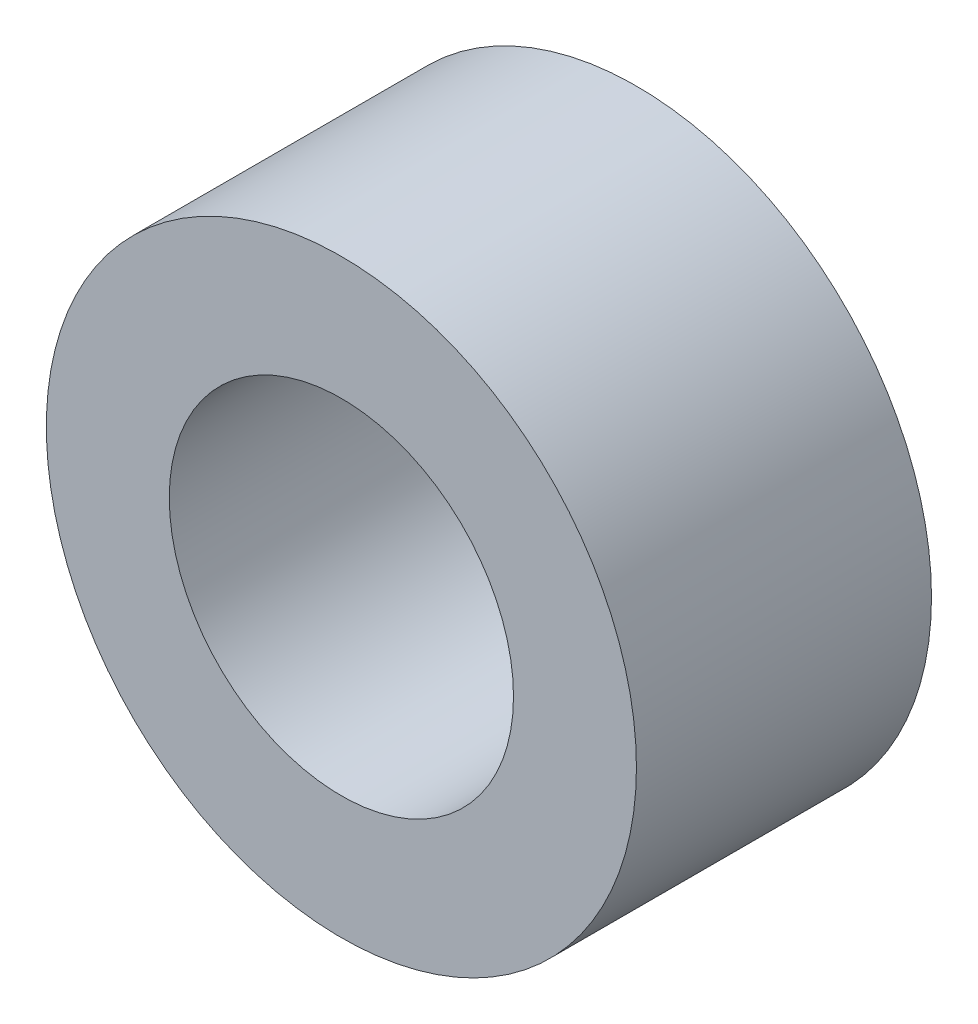
ISO-10303-21;
HEADER;
FILE_DESCRIPTION(('STEP AP214'),'2;1');
FILE_NAME('part.step','',(''),(''),'','','');
FILE_SCHEMA(('AUTOMOTIVE_DESIGN { 1 0 10303 214 1 1 1 1 }'));
ENDSEC;
DATA;
#1=APPLICATION_CONTEXT('core data for automotive mechanical design processes');
#2=APPLICATION_PROTOCOL_DEFINITION('international standard','automotive_design',2000,#1);
#3=PRODUCT_CONTEXT('',#1,'mechanical');
#4=PRODUCT('Part','Part','',(#3));
#5=PRODUCT_RELATED_PRODUCT_CATEGORY('part','',(#4));
#6=PRODUCT_DEFINITION_FORMATION('','',#4);
#7=PRODUCT_DEFINITION_CONTEXT('part definition',#1,'design');
#8=PRODUCT_DEFINITION('design','',#6,#7);
#9=PRODUCT_DEFINITION_SHAPE('','',#8);
#10=(LENGTH_UNIT() NAMED_UNIT(*) SI_UNIT(.MILLI.,.METRE.));
#11=(NAMED_UNIT(*) PLANE_ANGLE_UNIT() SI_UNIT($,.RADIAN.));
#12=(NAMED_UNIT(*) SI_UNIT($,.STERADIAN.) SOLID_ANGLE_UNIT());
#13=UNCERTAINTY_MEASURE_WITH_UNIT(LENGTH_MEASURE(1.E-05),#10,'distance_accuracy_value','');
#14=(GEOMETRIC_REPRESENTATION_CONTEXT(3) GLOBAL_UNCERTAINTY_ASSIGNED_CONTEXT((#13)) GLOBAL_UNIT_ASSIGNED_CONTEXT((#10,
#11,#12)) REPRESENTATION_CONTEXT('',''));
#15=CARTESIAN_POINT('',(0.,0.,0.));
#16=DIRECTION('',(0.,0.,1.));
#17=DIRECTION('',(1.,0.,0.));
#18=AXIS2_PLACEMENT_3D('',#15,#16,#17);
#19=CARTESIAN_POINT('',(0.,0.,3.));
#20=DIRECTION('',(0.,0.,1.));
#21=DIRECTION('',(1.,0.,0.));
#22=AXIS2_PLACEMENT_3D('',#19,#20,#21);
#23=PLANE('',#22);
#24=CARTESIAN_POINT('',(0.,0.,3.));
#25=DIRECTION('',(0.,0.,1.));
#26=DIRECTION('',(1.,0.,0.));
#27=AXIS2_PLACEMENT_3D('',#24,#25,#26);
#28=CIRCLE('',#27,3.);
#29=CARTESIAN_POINT('',(3.,0.,3.));
#30=VERTEX_POINT('',#29);
#31=EDGE_CURVE('E10',#30,#30,#28,.T.);
#32=ORIENTED_EDGE('',*,*,#31,.T.);
#33=EDGE_LOOP('',(#32));
#34=FACE_BOUND('',#33,.T.);
#35=CARTESIAN_POINT('',(0.,0.,3.));
#36=DIRECTION('',(0.,0.,1.));
#37=DIRECTION('',(1.,0.,0.));
#38=AXIS2_PLACEMENT_3D('',#35,#36,#37);
#39=CIRCLE('',#38,1.75);
#40=CARTESIAN_POINT('',(1.75,0.,3.));
#41=VERTEX_POINT('',#40);
#42=EDGE_CURVE('E41',#41,#41,#39,.T.);
#43=ORIENTED_EDGE('',*,*,#42,.F.);
#44=EDGE_LOOP('',(#43));
#45=FACE_BOUND('',#44,.T.);
#46=ADVANCED_FACE('F30',(#34,#45),#23,.T.);
#47=CARTESIAN_POINT('',(0.,0.,0.));
#48=DIRECTION('',(0.,0.,1.));
#49=DIRECTION('',(1.,0.,0.));
#50=AXIS2_PLACEMENT_3D('',#47,#48,#49);
#51=PLANE('',#50);
#52=CARTESIAN_POINT('',(0.,0.,0.));
#53=DIRECTION('',(0.,0.,1.));
#54=DIRECTION('',(1.,0.,0.));
#55=AXIS2_PLACEMENT_3D('',#52,#53,#54);
#56=CIRCLE('',#55,3.);
#57=CARTESIAN_POINT('',(3.,0.,0.));
#58=VERTEX_POINT('',#57);
#59=EDGE_CURVE('E34',#58,#58,#56,.T.);
#60=ORIENTED_EDGE('',*,*,#59,.F.);
#61=EDGE_LOOP('',(#60));
#62=FACE_BOUND('',#61,.T.);
#63=CARTESIAN_POINT('',(0.,0.,0.));
#64=DIRECTION('',(0.,0.,1.));
#65=DIRECTION('',(1.,0.,0.));
#66=AXIS2_PLACEMENT_3D('',#63,#64,#65);
#67=CIRCLE('',#66,1.75);
#68=CARTESIAN_POINT('',(1.75,0.,0.));
#69=VERTEX_POINT('',#68);
#70=EDGE_CURVE('E43',#69,#69,#67,.T.);
#71=ORIENTED_EDGE('',*,*,#70,.T.);
#72=EDGE_LOOP('',(#71));
#73=FACE_BOUND('',#72,.T.);
#74=ADVANCED_FACE('F53',(#62,#73),#51,.F.);
#75=CARTESIAN_POINT('',(0.,0.,3.));
#76=DIRECTION('',(0.,0.,-1.));
#77=DIRECTION('',(-1.,0.,0.));
#78=AXIS2_PLACEMENT_3D('',#75,#76,#77);
#79=CYLINDRICAL_SURFACE('',#78,3.);
#80=ORIENTED_EDGE('',*,*,#31,.F.);
#81=EDGE_LOOP('',(#80));
#82=FACE_BOUND('',#81,.T.);
#83=ORIENTED_EDGE('',*,*,#59,.T.);
#84=EDGE_LOOP('',(#83));
#85=FACE_BOUND('',#84,.T.);
#86=ADVANCED_FACE('F32',(#82,#85),#79,.T.);
#87=CARTESIAN_POINT('',(0.,0.,3.));
#88=DIRECTION('',(0.,0.,-1.));
#89=DIRECTION('',(-1.,0.,0.));
#90=AXIS2_PLACEMENT_3D('',#87,#88,#89);
#91=CYLINDRICAL_SURFACE('',#90,1.75);
#92=ORIENTED_EDGE('',*,*,#42,.T.);
#93=EDGE_LOOP('',(#92));
#94=FACE_BOUND('',#93,.T.);
#95=ORIENTED_EDGE('',*,*,#70,.F.);
#96=EDGE_LOOP('',(#95));
#97=FACE_BOUND('',#96,.T.);
#98=ADVANCED_FACE('F49',(#94,#97),#91,.F.);
#99=CLOSED_SHELL('',(#46,#74,#86,#98));
#100=MANIFOLD_SOLID_BREP('B2',#99);
#101=ADVANCED_BREP_SHAPE_REPRESENTATION('',(#18,#100),#14);
#102=SHAPE_DEFINITION_REPRESENTATION(#9,#101);
ENDSEC;
END-ISO-10303-21;
